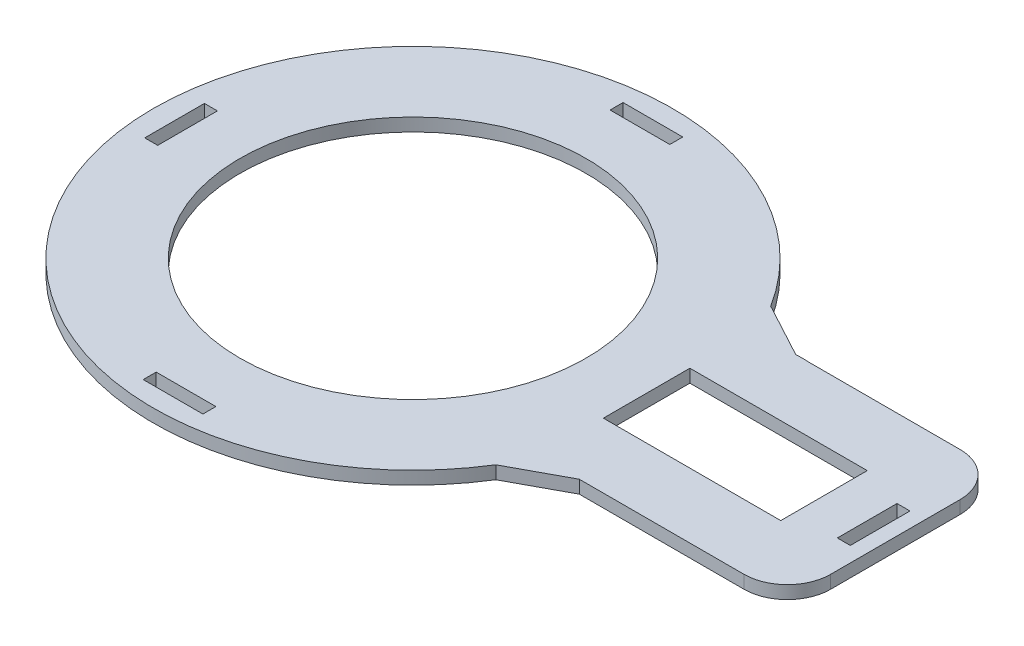
ISO-10303-21;
HEADER;
FILE_DESCRIPTION(('STEP AP214'),'2;1');
FILE_NAME('part.step','',(''),(''),'','','');
FILE_SCHEMA(('AUTOMOTIVE_DESIGN { 1 0 10303 214 1 1 1 1 }'));
ENDSEC;
DATA;
#1=APPLICATION_CONTEXT('core data for automotive mechanical design processes');
#2=APPLICATION_PROTOCOL_DEFINITION('international standard','automotive_design',2000,#1);
#3=PRODUCT_CONTEXT('',#1,'mechanical');
#4=PRODUCT('Part','Part','',(#3));
#5=PRODUCT_RELATED_PRODUCT_CATEGORY('part','',(#4));
#6=PRODUCT_DEFINITION_FORMATION('','',#4);
#7=PRODUCT_DEFINITION_CONTEXT('part definition',#1,'design');
#8=PRODUCT_DEFINITION('design','',#6,#7);
#9=PRODUCT_DEFINITION_SHAPE('','',#8);
#10=(LENGTH_UNIT() NAMED_UNIT(*) SI_UNIT(.MILLI.,.METRE.));
#11=(NAMED_UNIT(*) PLANE_ANGLE_UNIT() SI_UNIT($,.RADIAN.));
#12=(NAMED_UNIT(*) SI_UNIT($,.STERADIAN.) SOLID_ANGLE_UNIT());
#13=UNCERTAINTY_MEASURE_WITH_UNIT(LENGTH_MEASURE(1.E-05),#10,'distance_accuracy_value','');
#14=(GEOMETRIC_REPRESENTATION_CONTEXT(3) GLOBAL_UNCERTAINTY_ASSIGNED_CONTEXT((#13)) GLOBAL_UNIT_ASSIGNED_CONTEXT((#10,
#11,#12)) REPRESENTATION_CONTEXT('',''));
#15=CARTESIAN_POINT('',(0.,0.,0.));
#16=DIRECTION('',(0.,0.,1.));
#17=DIRECTION('',(1.,0.,0.));
#18=AXIS2_PLACEMENT_3D('',#15,#16,#17);
#19=CARTESIAN_POINT('',(65.,3.,0.));
#20=DIRECTION('',(0.,1.,0.));
#21=DIRECTION('',(0.,0.,1.));
#22=AXIS2_PLACEMENT_3D('',#19,#20,#21);
#23=PLANE('',#22);
#24=CARTESIAN_POINT('',(0.,3.,0.));
#25=DIRECTION('',(0.,1.,0.));
#26=DIRECTION('',(0.,0.,1.));
#27=AXIS2_PLACEMENT_3D('',#24,#25,#26);
#28=CIRCLE('',#27,40.);
#29=CARTESIAN_POINT('',(0.,3.,40.));
#30=VERTEX_POINT('',#29);
#31=EDGE_CURVE('E915',#30,#30,#28,.T.);
#32=ORIENTED_EDGE('',*,*,#31,.F.);
#33=EDGE_LOOP('',(#32));
#34=FACE_BOUND('',#33,.T.);
#35=DIRECTION('',(0.,0.,-1.));
#36=VECTOR('',#35,1.);
#37=CARTESIAN_POINT('',(95.0014401197598,3.,9.99999999999999));
#38=LINE('',#37,#36);
#39=CARTESIAN_POINT('',(95.0014401197598,3.,9.99999999999999));
#40=VERTEX_POINT('',#39);
#41=CARTESIAN_POINT('',(95.0014401197598,3.,-10.));
#42=VERTEX_POINT('',#41);
#43=EDGE_CURVE('E54',#40,#42,#38,.T.);
#44=ORIENTED_EDGE('',*,*,#43,.F.);
#45=DIRECTION('',(1.,0.,0.));
#46=VECTOR('',#45,1.);
#47=CARTESIAN_POINT('',(54.0014401197598,3.,9.99999999999999));
#48=LINE('',#47,#46);
#49=CARTESIAN_POINT('',(54.0014401197598,3.,9.99999999999999));
#50=VERTEX_POINT('',#49);
#51=EDGE_CURVE('E256',#50,#40,#48,.T.);
#52=ORIENTED_EDGE('',*,*,#51,.F.);
#53=DIRECTION('',(0.,0.,1.));
#54=VECTOR('',#53,1.);
#55=CARTESIAN_POINT('',(54.0014401197598,3.,9.99999999999999));
#56=LINE('',#55,#54);
#57=CARTESIAN_POINT('',(54.0014401197598,3.,-10.));
#58=VERTEX_POINT('',#57);
#59=EDGE_CURVE('E239',#58,#50,#56,.T.);
#60=ORIENTED_EDGE('',*,*,#59,.F.);
#61=DIRECTION('',(-1.,0.,0.));
#62=VECTOR('',#61,1.);
#63=CARTESIAN_POINT('',(54.0014401197598,3.,-10.));
#64=LINE('',#63,#62);
#65=EDGE_CURVE('E249',#42,#58,#64,.T.);
#66=ORIENTED_EDGE('',*,*,#65,.F.);
#67=EDGE_LOOP('',(#44,#52,#60,#66));
#68=FACE_BOUND('',#67,.T.);
#69=DIRECTION('',(0.880064172641751,0.,-0.474854769411017));
#70=VECTOR('',#69,1.);
#71=CARTESIAN_POINT('',(50.9013008311724,3.,31.7656665866543));
#72=LINE('',#71,#70);
#73=CARTESIAN_POINT('',(50.9013008311724,3.,31.7656665866543));
#74=VERTEX_POINT('',#73);
#75=CARTESIAN_POINT('',(63.5214401197598,3.,24.9562389129561));
#76=VERTEX_POINT('',#75);
#77=EDGE_CURVE('E459',#74,#76,#72,.T.);
#78=ORIENTED_EDGE('',*,*,#77,.T.);
#79=DIRECTION('',(0.,0.,1.));
#80=VECTOR('',#79,1.);
#81=CARTESIAN_POINT('',(63.5214401197598,3.,-24.9562389129561));
#82=LINE('',#81,#80);
#83=CARTESIAN_POINT('',(63.5214401197598,3.,25.));
#84=VERTEX_POINT('',#83);
#85=EDGE_CURVE('E299',#76,#84,#82,.T.);
#86=ORIENTED_EDGE('',*,*,#85,.T.);
#87=DIRECTION('',(1.,0.,0.));
#88=VECTOR('',#87,1.);
#89=CARTESIAN_POINT('',(63.5214401197598,3.,25.));
#90=LINE('',#89,#88);
#91=CARTESIAN_POINT('',(101.52144011976,3.,25.));
#92=VERTEX_POINT('',#91);
#93=EDGE_CURVE('E323',#84,#92,#90,.T.);
#94=ORIENTED_EDGE('',*,*,#93,.T.);
#95=CARTESIAN_POINT('',(101.52144011976,3.,15.));
#96=DIRECTION('',(0.,1.,0.));
#97=DIRECTION('',(0.,0.,1.));
#98=AXIS2_PLACEMENT_3D('',#95,#96,#97);
#99=CIRCLE('',#98,9.99999999999999);
#100=CARTESIAN_POINT('',(111.52144011976,3.,15.));
#101=VERTEX_POINT('',#100);
#102=EDGE_CURVE('E326',#92,#101,#99,.T.);
#103=ORIENTED_EDGE('',*,*,#102,.T.);
#104=DIRECTION('',(0.,0.,1.));
#105=VECTOR('',#104,1.);
#106=CARTESIAN_POINT('',(111.52144011976,3.,-14.9562389129561));
#107=LINE('',#106,#105);
#108=CARTESIAN_POINT('',(111.52144011976,3.,-14.9562389129561));
#109=VERTEX_POINT('',#108);
#110=EDGE_CURVE('E330',#109,#101,#107,.T.);
#111=ORIENTED_EDGE('',*,*,#110,.F.);
#112=CARTESIAN_POINT('',(101.52144011976,3.,-14.9562389129561));
#113=DIRECTION('',(0.,1.,0.));
#114=DIRECTION('',(0.,0.,1.));
#115=AXIS2_PLACEMENT_3D('',#112,#113,#114);
#116=CIRCLE('',#115,9.99999999999999);
#117=CARTESIAN_POINT('',(101.52144011976,3.,-24.9562389129561));
#118=VERTEX_POINT('',#117);
#119=EDGE_CURVE('E334',#109,#118,#116,.T.);
#120=ORIENTED_EDGE('',*,*,#119,.T.);
#121=DIRECTION('',(1.,0.,0.));
#122=VECTOR('',#121,1.);
#123=CARTESIAN_POINT('',(63.5214401197598,3.,-24.9562389129561));
#124=LINE('',#123,#122);
#125=CARTESIAN_POINT('',(66.4785598802402,3.,-24.9562389129561));
#126=VERTEX_POINT('',#125);
#127=EDGE_CURVE('E338',#126,#118,#124,.T.);
#128=ORIENTED_EDGE('',*,*,#127,.F.);
#129=CARTESIAN_POINT('',(65.,3.,0.));
#130=DIRECTION('',(0.,1.,0.));
#131=DIRECTION('',(0.,0.,1.));
#132=AXIS2_PLACEMENT_3D('',#129,#130,#131);
#133=CIRCLE('',#132,25.);
#134=CARTESIAN_POINT('',(63.5214401197598,3.,-24.9562389129561));
#135=VERTEX_POINT('',#134);
#136=EDGE_CURVE('E449',#126,#135,#133,.T.);
#137=ORIENTED_EDGE('',*,*,#136,.T.);
#138=DIRECTION('',(-0.880064172641751,0.,-0.474854769411017));
#139=VECTOR('',#138,1.);
#140=CARTESIAN_POINT('',(50.9013008311724,3.,-31.7656665866543));
#141=LINE('',#140,#139);
#142=CARTESIAN_POINT('',(50.9013008311724,3.,-31.7656665866543));
#143=VERTEX_POINT('',#142);
#144=EDGE_CURVE('E452',#135,#143,#141,.T.);
#145=ORIENTED_EDGE('',*,*,#144,.T.);
#146=CARTESIAN_POINT('',(0.,3.,0.));
#147=DIRECTION('',(0.,1.,0.));
#148=DIRECTION('',(0.,0.,1.));
#149=AXIS2_PLACEMENT_3D('',#146,#147,#148);
#150=CIRCLE('',#149,60.);
#151=EDGE_CURVE('E456',#143,#74,#150,.T.);
#152=ORIENTED_EDGE('',*,*,#151,.T.);
#153=EDGE_LOOP('',(#78,#86,#94,#103,#111,#120,#128,#137,#145,#152));
#154=FACE_BOUND('',#153,.T.);
#155=DIRECTION('',(0.,0.,-1.));
#156=VECTOR('',#155,1.);
#157=CARTESIAN_POINT('',(6.9,3.,55.4568517539151));
#158=LINE('',#157,#156);
#159=CARTESIAN_POINT('',(6.9,3.,55.4568517539151));
#160=VERTEX_POINT('',#159);
#161=CARTESIAN_POINT('',(6.9,3.,52.4568517539151));
#162=VERTEX_POINT('',#161);
#163=EDGE_CURVE('E365',#160,#162,#158,.T.);
#164=ORIENTED_EDGE('',*,*,#163,.F.);
#165=DIRECTION('',(1.,0.,0.));
#166=VECTOR('',#165,1.);
#167=CARTESIAN_POINT('',(-6.9,3.,55.4568517539151));
#168=LINE('',#167,#166);
#169=CARTESIAN_POINT('',(-6.9,3.,55.4568517539151));
#170=VERTEX_POINT('',#169);
#171=EDGE_CURVE('E377',#170,#160,#168,.T.);
#172=ORIENTED_EDGE('',*,*,#171,.F.);
#173=DIRECTION('',(0.,0.,1.));
#174=VECTOR('',#173,1.);
#175=CARTESIAN_POINT('',(-6.9,3.,55.4568517539151));
#176=LINE('',#175,#174);
#177=CARTESIAN_POINT('',(-6.9,3.,52.4568517539151));
#178=VERTEX_POINT('',#177);
#179=EDGE_CURVE('E373',#178,#170,#176,.T.);
#180=ORIENTED_EDGE('',*,*,#179,.F.);
#181=DIRECTION('',(-1.,0.,0.));
#182=VECTOR('',#181,1.);
#183=CARTESIAN_POINT('',(-6.9,3.,52.4568517539151));
#184=LINE('',#183,#182);
#185=EDGE_CURVE('E368',#162,#178,#184,.T.);
#186=ORIENTED_EDGE('',*,*,#185,.F.);
#187=EDGE_LOOP('',(#164,#172,#180,#186));
#188=FACE_BOUND('',#187,.T.);
#189=DIRECTION('',(0.,0.,-1.));
#190=VECTOR('',#189,1.);
#191=CARTESIAN_POINT('',(-52.1052277201253,3.,6.9));
#192=LINE('',#191,#190);
#193=CARTESIAN_POINT('',(-52.1052277201253,3.,6.9));
#194=VERTEX_POINT('',#193);
#195=CARTESIAN_POINT('',(-52.1052277201253,3.,-6.9));
#196=VERTEX_POINT('',#195);
#197=EDGE_CURVE('E395',#194,#196,#192,.T.);
#198=ORIENTED_EDGE('',*,*,#197,.F.);
#199=DIRECTION('',(1.,0.,0.));
#200=VECTOR('',#199,1.);
#201=CARTESIAN_POINT('',(-55.1052277201253,3.,6.9));
#202=LINE('',#201,#200);
#203=CARTESIAN_POINT('',(-55.1052277201253,3.,6.9));
#204=VERTEX_POINT('',#203);
#205=EDGE_CURVE('E407',#204,#194,#202,.T.);
#206=ORIENTED_EDGE('',*,*,#205,.F.);
#207=DIRECTION('',(0.,0.,1.));
#208=VECTOR('',#207,1.);
#209=CARTESIAN_POINT('',(-55.1052277201253,3.,6.9));
#210=LINE('',#209,#208);
#211=CARTESIAN_POINT('',(-55.1052277201253,3.,-6.9));
#212=VERTEX_POINT('',#211);
#213=EDGE_CURVE('E403',#212,#204,#210,.T.);
#214=ORIENTED_EDGE('',*,*,#213,.F.);
#215=DIRECTION('',(-1.,0.,0.));
#216=VECTOR('',#215,1.);
#217=CARTESIAN_POINT('',(-55.1052277201253,3.,-6.9));
#218=LINE('',#217,#216);
#219=EDGE_CURVE('E398',#196,#212,#218,.T.);
#220=ORIENTED_EDGE('',*,*,#219,.F.);
#221=EDGE_LOOP('',(#198,#206,#214,#220));
#222=FACE_BOUND('',#221,.T.);
#223=DIRECTION('',(0.,0.,1.));
#224=VECTOR('',#223,1.);
#225=CARTESIAN_POINT('',(-6.9,3.,-55.4568517539151));
#226=LINE('',#225,#224);
#227=CARTESIAN_POINT('',(-6.9,3.,-55.4568517539151));
#228=VERTEX_POINT('',#227);
#229=CARTESIAN_POINT('',(-6.9,3.,-52.4568517539151));
#230=VERTEX_POINT('',#229);
#231=EDGE_CURVE('E364',#228,#230,#226,.T.);
#232=ORIENTED_EDGE('',*,*,#231,.F.);
#233=DIRECTION('',(-1.,0.,0.));
#234=VECTOR('',#233,1.);
#235=CARTESIAN_POINT('',(-6.9,3.,-55.4568517539151));
#236=LINE('',#235,#234);
#237=CARTESIAN_POINT('',(6.9,3.,-55.4568517539151));
#238=VERTEX_POINT('',#237);
#239=EDGE_CURVE('E433',#238,#228,#236,.T.);
#240=ORIENTED_EDGE('',*,*,#239,.F.);
#241=DIRECTION('',(0.,0.,-1.));
#242=VECTOR('',#241,1.);
#243=CARTESIAN_POINT('',(6.9,3.,-55.4568517539151));
#244=LINE('',#243,#242);
#245=CARTESIAN_POINT('',(6.9,3.,-52.4568517539151));
#246=VERTEX_POINT('',#245);
#247=EDGE_CURVE('E429',#246,#238,#244,.T.);
#248=ORIENTED_EDGE('',*,*,#247,.F.);
#249=DIRECTION('',(1.,0.,0.));
#250=VECTOR('',#249,1.);
#251=CARTESIAN_POINT('',(-6.9,3.,-52.4568517539151));
#252=LINE('',#251,#250);
#253=EDGE_CURVE('E425',#230,#246,#252,.T.);
#254=ORIENTED_EDGE('',*,*,#253,.F.);
#255=EDGE_LOOP('',(#232,#240,#248,#254));
#256=FACE_BOUND('',#255,.T.);
#257=DIRECTION('',(0.,0.,-1.));
#258=VECTOR('',#257,1.);
#259=CARTESIAN_POINT('',(108.02144011976,3.,6.94376108704391));
#260=LINE('',#259,#258);
#261=CARTESIAN_POINT('',(108.02144011976,3.,6.94376108704391));
#262=VERTEX_POINT('',#261);
#263=CARTESIAN_POINT('',(108.02144011976,3.,-6.85623891295609));
#264=VERTEX_POINT('',#263);
#265=EDGE_CURVE('E282',#262,#264,#260,.T.);
#266=ORIENTED_EDGE('',*,*,#265,.F.);
#267=DIRECTION('',(-1.,0.,0.));
#268=VECTOR('',#267,1.);
#269=CARTESIAN_POINT('',(108.02144011976,3.,6.94376108704391));
#270=LINE('',#269,#268);
#271=CARTESIAN_POINT('',(105.02144011976,3.,6.94376108704391));
#272=VERTEX_POINT('',#271);
#273=EDGE_CURVE('E266',#262,#272,#270,.T.);
#274=ORIENTED_EDGE('',*,*,#273,.T.);
#275=DIRECTION('',(0.,0.,-1.));
#276=VECTOR('',#275,1.);
#277=CARTESIAN_POINT('',(105.02144011976,3.,6.94376108704391));
#278=LINE('',#277,#276);
#279=CARTESIAN_POINT('',(105.02144011976,3.,-6.85623891295609));
#280=VERTEX_POINT('',#279);
#281=EDGE_CURVE('E274',#272,#280,#278,.T.);
#282=ORIENTED_EDGE('',*,*,#281,.T.);
#283=DIRECTION('',(-1.,0.,0.));
#284=VECTOR('',#283,1.);
#285=CARTESIAN_POINT('',(108.02144011976,3.,-6.85623891295609));
#286=LINE('',#285,#284);
#287=EDGE_CURVE('E278',#264,#280,#286,.T.);
#288=ORIENTED_EDGE('',*,*,#287,.F.);
#289=EDGE_LOOP('',(#266,#274,#282,#288));
#290=FACE_BOUND('',#289,.T.);
#291=ADVANCED_FACE('F38',(#34,#68,#154,#188,#222,#256,#290),#23,.T.);
#292=CARTESIAN_POINT('',(65.,0.,0.));
#293=DIRECTION('',(0.,1.,0.));
#294=DIRECTION('',(0.,0.,1.));
#295=AXIS2_PLACEMENT_3D('',#292,#293,#294);
#296=PLANE('',#295);
#297=CARTESIAN_POINT('',(0.,0.,0.));
#298=DIRECTION('',(0.,1.,0.));
#299=DIRECTION('',(0.,0.,1.));
#300=AXIS2_PLACEMENT_3D('',#297,#298,#299);
#301=CIRCLE('',#300,40.);
#302=CARTESIAN_POINT('',(0.,0.,40.));
#303=VERTEX_POINT('',#302);
#304=EDGE_CURVE('E913',#303,#303,#301,.T.);
#305=ORIENTED_EDGE('',*,*,#304,.T.);
#306=EDGE_LOOP('',(#305));
#307=FACE_BOUND('',#306,.T.);
#308=DIRECTION('',(1.,0.,0.));
#309=VECTOR('',#308,1.);
#310=CARTESIAN_POINT('',(65.,0.,9.99999999999999));
#311=LINE('',#310,#309);
#312=CARTESIAN_POINT('',(54.0014401197598,0.,9.99999999999999));
#313=VERTEX_POINT('',#312);
#314=CARTESIAN_POINT('',(95.0014401197598,0.,9.99999999999999));
#315=VERTEX_POINT('',#314);
#316=EDGE_CURVE('E47',#313,#315,#311,.T.);
#317=ORIENTED_EDGE('',*,*,#316,.T.);
#318=DIRECTION('',(0.,0.,-1.));
#319=VECTOR('',#318,1.);
#320=CARTESIAN_POINT('',(95.0014401197598,0.,0.));
#321=LINE('',#320,#319);
#322=CARTESIAN_POINT('',(95.0014401197598,0.,-10.));
#323=VERTEX_POINT('',#322);
#324=EDGE_CURVE('E11',#315,#323,#321,.T.);
#325=ORIENTED_EDGE('',*,*,#324,.T.);
#326=DIRECTION('',(-1.,0.,0.));
#327=VECTOR('',#326,1.);
#328=CARTESIAN_POINT('',(65.,0.,-10.));
#329=LINE('',#328,#327);
#330=CARTESIAN_POINT('',(54.0014401197598,0.,-10.));
#331=VERTEX_POINT('',#330);
#332=EDGE_CURVE('E550',#323,#331,#329,.T.);
#333=ORIENTED_EDGE('',*,*,#332,.T.);
#334=DIRECTION('',(0.,0.,1.));
#335=VECTOR('',#334,1.);
#336=CARTESIAN_POINT('',(54.0014401197598,0.,0.));
#337=LINE('',#336,#335);
#338=EDGE_CURVE('E242',#331,#313,#337,.T.);
#339=ORIENTED_EDGE('',*,*,#338,.T.);
#340=EDGE_LOOP('',(#317,#325,#333,#339));
#341=FACE_BOUND('',#340,.T.);
#342=DIRECTION('',(-0.880064172641751,0.,-0.474854769411017));
#343=VECTOR('',#342,1.);
#344=CARTESIAN_POINT('',(50.9013008311724,0.,-31.7656665866543));
#345=LINE('',#344,#343);
#346=CARTESIAN_POINT('',(63.5214401197598,0.,-24.9562389129561));
#347=VERTEX_POINT('',#346);
#348=CARTESIAN_POINT('',(50.9013008311724,0.,-31.7656665866543));
#349=VERTEX_POINT('',#348);
#350=EDGE_CURVE('E465',#347,#349,#345,.T.);
#351=ORIENTED_EDGE('',*,*,#350,.F.);
#352=CARTESIAN_POINT('',(65.,0.,0.));
#353=DIRECTION('',(0.,1.,0.));
#354=DIRECTION('',(0.,0.,1.));
#355=AXIS2_PLACEMENT_3D('',#352,#353,#354);
#356=CIRCLE('',#355,25.);
#357=CARTESIAN_POINT('',(66.4785598802402,0.,-24.9562389129561));
#358=VERTEX_POINT('',#357);
#359=EDGE_CURVE('E385',#358,#347,#356,.T.);
#360=ORIENTED_EDGE('',*,*,#359,.F.);
#361=DIRECTION('',(-1.,0.,0.));
#362=VECTOR('',#361,1.);
#363=CARTESIAN_POINT('',(63.5214401197598,0.,-24.9562389129561));
#364=LINE('',#363,#362);
#365=CARTESIAN_POINT('',(101.52144011976,0.,-24.9562389129561));
#366=VERTEX_POINT('',#365);
#367=EDGE_CURVE('E311',#366,#358,#364,.T.);
#368=ORIENTED_EDGE('',*,*,#367,.F.);
#369=CARTESIAN_POINT('',(101.52144011976,0.,-14.9562389129561));
#370=DIRECTION('',(0.,1.,0.));
#371=DIRECTION('',(0.,0.,1.));
#372=AXIS2_PLACEMENT_3D('',#369,#370,#371);
#373=CIRCLE('',#372,9.99999999999999);
#374=CARTESIAN_POINT('',(111.52144011976,0.,-14.9562389129561));
#375=VERTEX_POINT('',#374);
#376=EDGE_CURVE('E308',#366,#375,#373,.F.);
#377=ORIENTED_EDGE('',*,*,#376,.T.);
#378=DIRECTION('',(0.,0.,-1.));
#379=VECTOR('',#378,1.);
#380=CARTESIAN_POINT('',(111.52144011976,0.,-14.9562389129561));
#381=LINE('',#380,#379);
#382=CARTESIAN_POINT('',(111.52144011976,0.,15.));
#383=VERTEX_POINT('',#382);
#384=EDGE_CURVE('E303',#383,#375,#381,.T.);
#385=ORIENTED_EDGE('',*,*,#384,.F.);
#386=CARTESIAN_POINT('',(101.52144011976,0.,15.));
#387=DIRECTION('',(0.,1.,0.));
#388=DIRECTION('',(0.,0.,1.));
#389=AXIS2_PLACEMENT_3D('',#386,#387,#388);
#390=CIRCLE('',#389,9.99999999999999);
#391=CARTESIAN_POINT('',(101.52144011976,0.,25.));
#392=VERTEX_POINT('',#391);
#393=EDGE_CURVE('E300',#383,#392,#390,.F.);
#394=ORIENTED_EDGE('',*,*,#393,.T.);
#395=DIRECTION('',(-1.,0.,0.));
#396=VECTOR('',#395,1.);
#397=CARTESIAN_POINT('',(63.5214401197598,0.,25.));
#398=LINE('',#397,#396);
#399=CARTESIAN_POINT('',(63.5214401197598,0.,25.));
#400=VERTEX_POINT('',#399);
#401=EDGE_CURVE('E319',#392,#400,#398,.T.);
#402=ORIENTED_EDGE('',*,*,#401,.T.);
#403=DIRECTION('',(0.,0.,-1.));
#404=VECTOR('',#403,1.);
#405=CARTESIAN_POINT('',(63.5214401197598,0.,-24.9562389129561));
#406=LINE('',#405,#404);
#407=CARTESIAN_POINT('',(63.5214401197598,0.,24.9562389129561));
#408=VERTEX_POINT('',#407);
#409=EDGE_CURVE('E315',#400,#408,#406,.T.);
#410=ORIENTED_EDGE('',*,*,#409,.T.);
#411=DIRECTION('',(0.880064172641751,0.,-0.474854769411017));
#412=VECTOR('',#411,1.);
#413=CARTESIAN_POINT('',(50.9013008311724,0.,31.7656665866543));
#414=LINE('',#413,#412);
#415=CARTESIAN_POINT('',(50.9013008311724,0.,31.7656665866543));
#416=VERTEX_POINT('',#415);
#417=EDGE_CURVE('E453',#416,#408,#414,.T.);
#418=ORIENTED_EDGE('',*,*,#417,.F.);
#419=CARTESIAN_POINT('',(0.,0.,0.));
#420=DIRECTION('',(0.,1.,0.));
#421=DIRECTION('',(0.,0.,1.));
#422=AXIS2_PLACEMENT_3D('',#419,#420,#421);
#423=CIRCLE('',#422,60.);
#424=EDGE_CURVE('E468',#349,#416,#423,.T.);
#425=ORIENTED_EDGE('',*,*,#424,.F.);
#426=EDGE_LOOP('',(#351,#360,#368,#377,#385,#394,#402,#410,#418,#425));
#427=FACE_BOUND('',#426,.T.);
#428=DIRECTION('',(-1.,0.,0.));
#429=VECTOR('',#428,1.);
#430=CARTESIAN_POINT('',(65.,0.,-55.4568517539151));
#431=LINE('',#430,#429);
#432=CARTESIAN_POINT('',(6.9,0.,-55.4568517539151));
#433=VERTEX_POINT('',#432);
#434=CARTESIAN_POINT('',(-6.9,0.,-55.4568517539151));
#435=VERTEX_POINT('',#434);
#436=EDGE_CURVE('E496',#433,#435,#431,.T.);
#437=ORIENTED_EDGE('',*,*,#436,.T.);
#438=DIRECTION('',(0.,0.,1.));
#439=VECTOR('',#438,1.);
#440=CARTESIAN_POINT('',(-6.90000000000003,0.,0.));
#441=LINE('',#440,#439);
#442=CARTESIAN_POINT('',(-6.9,0.,-52.4568517539151));
#443=VERTEX_POINT('',#442);
#444=EDGE_CURVE('E500',#435,#443,#441,.T.);
#445=ORIENTED_EDGE('',*,*,#444,.T.);
#446=DIRECTION('',(1.,0.,0.));
#447=VECTOR('',#446,1.);
#448=CARTESIAN_POINT('',(65.,0.,-52.4568517539151));
#449=LINE('',#448,#447);
#450=CARTESIAN_POINT('',(6.9,0.,-52.4568517539151));
#451=VERTEX_POINT('',#450);
#452=EDGE_CURVE('E488',#443,#451,#449,.T.);
#453=ORIENTED_EDGE('',*,*,#452,.T.);
#454=DIRECTION('',(0.,0.,-1.));
#455=VECTOR('',#454,1.);
#456=CARTESIAN_POINT('',(6.9,0.,0.));
#457=LINE('',#456,#455);
#458=EDGE_CURVE('E492',#451,#433,#457,.T.);
#459=ORIENTED_EDGE('',*,*,#458,.T.);
#460=EDGE_LOOP('',(#437,#445,#453,#459));
#461=FACE_BOUND('',#460,.T.);
#462=DIRECTION('',(1.,0.,0.));
#463=VECTOR('',#462,1.);
#464=CARTESIAN_POINT('',(65.,0.,6.9));
#465=LINE('',#464,#463);
#466=CARTESIAN_POINT('',(-55.1052277201253,0.,6.9));
#467=VERTEX_POINT('',#466);
#468=CARTESIAN_POINT('',(-52.1052277201253,0.,6.9));
#469=VERTEX_POINT('',#468);
#470=EDGE_CURVE('E512',#467,#469,#465,.T.);
#471=ORIENTED_EDGE('',*,*,#470,.T.);
#472=DIRECTION('',(0.,0.,-1.));
#473=VECTOR('',#472,1.);
#474=CARTESIAN_POINT('',(-52.1052277201253,0.,0.));
#475=LINE('',#474,#473);
#476=CARTESIAN_POINT('',(-52.1052277201253,0.,-6.9));
#477=VERTEX_POINT('',#476);
#478=EDGE_CURVE('E516',#469,#477,#475,.T.);
#479=ORIENTED_EDGE('',*,*,#478,.T.);
#480=DIRECTION('',(-1.,0.,0.));
#481=VECTOR('',#480,1.);
#482=CARTESIAN_POINT('',(65.,0.,-6.9));
#483=LINE('',#482,#481);
#484=CARTESIAN_POINT('',(-55.1052277201253,0.,-6.9));
#485=VERTEX_POINT('',#484);
#486=EDGE_CURVE('E504',#477,#485,#483,.T.);
#487=ORIENTED_EDGE('',*,*,#486,.T.);
#488=DIRECTION('',(0.,0.,1.));
#489=VECTOR('',#488,1.);
#490=CARTESIAN_POINT('',(-55.1052277201253,0.,0.));
#491=LINE('',#490,#489);
#492=EDGE_CURVE('E508',#485,#467,#491,.T.);
#493=ORIENTED_EDGE('',*,*,#492,.T.);
#494=EDGE_LOOP('',(#471,#479,#487,#493));
#495=FACE_BOUND('',#494,.T.);
#496=DIRECTION('',(1.,0.,0.));
#497=VECTOR('',#496,1.);
#498=CARTESIAN_POINT('',(65.,0.,55.4568517539151));
#499=LINE('',#498,#497);
#500=CARTESIAN_POINT('',(-6.9,0.,55.4568517539151));
#501=VERTEX_POINT('',#500);
#502=CARTESIAN_POINT('',(6.9,0.,55.4568517539151));
#503=VERTEX_POINT('',#502);
#504=EDGE_CURVE('E528',#501,#503,#499,.T.);
#505=ORIENTED_EDGE('',*,*,#504,.T.);
#506=DIRECTION('',(0.,0.,-1.));
#507=VECTOR('',#506,1.);
#508=CARTESIAN_POINT('',(6.9,0.,0.));
#509=LINE('',#508,#507);
#510=CARTESIAN_POINT('',(6.9,0.,52.4568517539151));
#511=VERTEX_POINT('',#510);
#512=EDGE_CURVE('E532',#503,#511,#509,.T.);
#513=ORIENTED_EDGE('',*,*,#512,.T.);
#514=DIRECTION('',(-1.,0.,0.));
#515=VECTOR('',#514,1.);
#516=CARTESIAN_POINT('',(65.,0.,52.4568517539151));
#517=LINE('',#516,#515);
#518=CARTESIAN_POINT('',(-6.9,0.,52.4568517539151));
#519=VERTEX_POINT('',#518);
#520=EDGE_CURVE('E520',#511,#519,#517,.T.);
#521=ORIENTED_EDGE('',*,*,#520,.T.);
#522=DIRECTION('',(0.,0.,1.));
#523=VECTOR('',#522,1.);
#524=CARTESIAN_POINT('',(-6.90000000000003,0.,0.));
#525=LINE('',#524,#523);
#526=EDGE_CURVE('E524',#519,#501,#525,.T.);
#527=ORIENTED_EDGE('',*,*,#526,.T.);
#528=EDGE_LOOP('',(#505,#513,#521,#527));
#529=FACE_BOUND('',#528,.T.);
#530=DIRECTION('',(-1.,0.,0.));
#531=VECTOR('',#530,1.);
#532=CARTESIAN_POINT('',(65.,0.,6.94376108704391));
#533=LINE('',#532,#531);
#534=CARTESIAN_POINT('',(108.02144011976,0.,6.94376108704391));
#535=VERTEX_POINT('',#534);
#536=CARTESIAN_POINT('',(105.02144011976,0.,6.94376108704391));
#537=VERTEX_POINT('',#536);
#538=EDGE_CURVE('E547',#535,#537,#533,.T.);
#539=ORIENTED_EDGE('',*,*,#538,.F.);
#540=DIRECTION('',(0.,0.,-1.));
#541=VECTOR('',#540,1.);
#542=CARTESIAN_POINT('',(108.02144011976,0.,0.));
#543=LINE('',#542,#541);
#544=CARTESIAN_POINT('',(108.02144011976,0.,-6.85623891295609));
#545=VERTEX_POINT('',#544);
#546=EDGE_CURVE('E536',#535,#545,#543,.T.);
#547=ORIENTED_EDGE('',*,*,#546,.T.);
#548=DIRECTION('',(-1.,0.,0.));
#549=VECTOR('',#548,1.);
#550=CARTESIAN_POINT('',(65.,0.,-6.85623891295609));
#551=LINE('',#550,#549);
#552=CARTESIAN_POINT('',(105.02144011976,0.,-6.85623891295609));
#553=VERTEX_POINT('',#552);
#554=EDGE_CURVE('E540',#545,#553,#551,.T.);
#555=ORIENTED_EDGE('',*,*,#554,.T.);
#556=DIRECTION('',(0.,0.,-1.));
#557=VECTOR('',#556,1.);
#558=CARTESIAN_POINT('',(105.02144011976,0.,0.));
#559=LINE('',#558,#557);
#560=EDGE_CURVE('E544',#537,#553,#559,.T.);
#561=ORIENTED_EDGE('',*,*,#560,.F.);
#562=EDGE_LOOP('',(#539,#547,#555,#561));
#563=FACE_BOUND('',#562,.T.);
#564=ADVANCED_FACE('F557',(#307,#341,#427,#461,#495,#529,#563),#296,.F.);
#565=CARTESIAN_POINT('',(65.,3.,0.));
#566=DIRECTION('',(0.,-1.,0.));
#567=DIRECTION('',(0.,0.,-1.));
#568=AXIS2_PLACEMENT_3D('',#565,#566,#567);
#569=CYLINDRICAL_SURFACE('',#568,25.);
#570=DIRECTION('',(0.,-1.,0.));
#571=VECTOR('',#570,1.);
#572=CARTESIAN_POINT('',(66.4785598802402,3.,-24.9562389129561));
#573=LINE('',#572,#571);
#574=EDGE_CURVE('E360',#358,#126,#573,.F.);
#575=ORIENTED_EDGE('',*,*,#574,.F.);
#576=ORIENTED_EDGE('',*,*,#359,.T.);
#577=DIRECTION('',(0.,-1.,0.));
#578=VECTOR('',#577,1.);
#579=CARTESIAN_POINT('',(63.5214401197598,3.,-24.9562389129561));
#580=LINE('',#579,#578);
#581=EDGE_CURVE('E484',#135,#347,#580,.T.);
#582=ORIENTED_EDGE('',*,*,#581,.F.);
#583=ORIENTED_EDGE('',*,*,#136,.F.);
#584=EDGE_LOOP('',(#575,#576,#582,#583));
#585=FACE_BOUND('',#584,.T.);
#586=ADVANCED_FACE('F40',(#585),#569,.T.);
#587=CARTESIAN_POINT('',(50.9013008311724,3.,-31.7656665866543));
#588=DIRECTION('',(-0.474854769411017,0.,0.880064172641751));
#589=DIRECTION('',(0.880064172641751,0.,0.474854769411017));
#590=AXIS2_PLACEMENT_3D('',#587,#588,#589);
#591=PLANE('',#590);
#592=ORIENTED_EDGE('',*,*,#350,.T.);
#593=DIRECTION('',(0.,-1.,0.));
#594=VECTOR('',#593,1.);
#595=CARTESIAN_POINT('',(50.9013008311724,3.,-31.7656665866543));
#596=LINE('',#595,#594);
#597=EDGE_CURVE('E480',#143,#349,#596,.T.);
#598=ORIENTED_EDGE('',*,*,#597,.F.);
#599=ORIENTED_EDGE('',*,*,#144,.F.);
#600=ORIENTED_EDGE('',*,*,#581,.T.);
#601=EDGE_LOOP('',(#592,#598,#599,#600));
#602=FACE_BOUND('',#601,.T.);
#603=ADVANCED_FACE('F595',(#602),#591,.F.);
#604=CARTESIAN_POINT('',(0.,3.,0.));
#605=DIRECTION('',(0.,-1.,0.));
#606=DIRECTION('',(0.,0.,-1.));
#607=AXIS2_PLACEMENT_3D('',#604,#605,#606);
#608=CYLINDRICAL_SURFACE('',#607,60.);
#609=ORIENTED_EDGE('',*,*,#424,.T.);
#610=DIRECTION('',(0.,-1.,0.));
#611=VECTOR('',#610,1.);
#612=CARTESIAN_POINT('',(50.9013008311724,3.,31.7656665866543));
#613=LINE('',#612,#611);
#614=EDGE_CURVE('E476',#74,#416,#613,.T.);
#615=ORIENTED_EDGE('',*,*,#614,.F.);
#616=ORIENTED_EDGE('',*,*,#151,.F.);
#617=ORIENTED_EDGE('',*,*,#597,.T.);
#618=EDGE_LOOP('',(#609,#615,#616,#617));
#619=FACE_BOUND('',#618,.T.);
#620=ADVANCED_FACE('F592',(#619),#608,.T.);
#621=CARTESIAN_POINT('',(50.9013008311724,3.,31.7656665866543));
#622=DIRECTION('',(-0.474854769411017,0.,-0.880064172641751));
#623=DIRECTION('',(-0.880064172641751,0.,0.474854769411017));
#624=AXIS2_PLACEMENT_3D('',#621,#622,#623);
#625=PLANE('',#624);
#626=ORIENTED_EDGE('',*,*,#417,.T.);
#627=DIRECTION('',(0.,-1.,0.));
#628=VECTOR('',#627,1.);
#629=CARTESIAN_POINT('',(63.5214401197598,3.,24.9562389129561));
#630=LINE('',#629,#628);
#631=EDGE_CURVE('E462',#76,#408,#630,.T.);
#632=ORIENTED_EDGE('',*,*,#631,.F.);
#633=ORIENTED_EDGE('',*,*,#77,.F.);
#634=ORIENTED_EDGE('',*,*,#614,.T.);
#635=EDGE_LOOP('',(#626,#632,#633,#634));
#636=FACE_BOUND('',#635,.T.);
#637=ADVANCED_FACE('F589',(#636),#625,.F.);
#638=CARTESIAN_POINT('',(-6.9,-7.,-55.4568517539151));
#639=DIRECTION('',(-1.,0.,0.));
#640=DIRECTION('',(0.,0.,1.));
#641=AXIS2_PLACEMENT_3D('',#638,#639,#640);
#642=PLANE('',#641);
#643=DIRECTION('',(0.,1.,0.));
#644=VECTOR('',#643,1.);
#645=CARTESIAN_POINT('',(-6.9,-7.,-55.4568517539151));
#646=LINE('',#645,#644);
#647=EDGE_CURVE('E399',#435,#228,#646,.T.);
#648=ORIENTED_EDGE('',*,*,#647,.T.);
#649=ORIENTED_EDGE('',*,*,#231,.T.);
#650=DIRECTION('',(0.,1.,0.));
#651=VECTOR('',#650,1.);
#652=CARTESIAN_POINT('',(-6.9,-7.,-52.4568517539151));
#653=LINE('',#652,#651);
#654=EDGE_CURVE('E437',#443,#230,#653,.T.);
#655=ORIENTED_EDGE('',*,*,#654,.F.);
#656=ORIENTED_EDGE('',*,*,#444,.F.);
#657=EDGE_LOOP('',(#648,#649,#655,#656));
#658=FACE_BOUND('',#657,.T.);
#659=ADVANCED_FACE('F586',(#658),#642,.F.);
#660=CARTESIAN_POINT('',(-6.9,-7.,-55.4568517539151));
#661=DIRECTION('',(0.,0.,-1.));
#662=DIRECTION('',(-1.,0.,0.));
#663=AXIS2_PLACEMENT_3D('',#660,#661,#662);
#664=PLANE('',#663);
#665=DIRECTION('',(0.,1.,0.));
#666=VECTOR('',#665,1.);
#667=CARTESIAN_POINT('',(6.9,-7.,-55.4568517539151));
#668=LINE('',#667,#666);
#669=EDGE_CURVE('E440',#433,#238,#668,.T.);
#670=ORIENTED_EDGE('',*,*,#669,.T.);
#671=ORIENTED_EDGE('',*,*,#239,.T.);
#672=ORIENTED_EDGE('',*,*,#647,.F.);
#673=ORIENTED_EDGE('',*,*,#436,.F.);
#674=EDGE_LOOP('',(#670,#671,#672,#673));
#675=FACE_BOUND('',#674,.T.);
#676=ADVANCED_FACE('F688',(#675),#664,.F.);
#677=CARTESIAN_POINT('',(6.9,-7.,-55.4568517539151));
#678=DIRECTION('',(1.,0.,0.));
#679=DIRECTION('',(0.,0.,-1.));
#680=AXIS2_PLACEMENT_3D('',#677,#678,#679);
#681=PLANE('',#680);
#682=DIRECTION('',(0.,1.,0.));
#683=VECTOR('',#682,1.);
#684=CARTESIAN_POINT('',(6.9,-7.,-52.4568517539151));
#685=LINE('',#684,#683);
#686=EDGE_CURVE('E443',#451,#246,#685,.T.);
#687=ORIENTED_EDGE('',*,*,#686,.T.);
#688=ORIENTED_EDGE('',*,*,#247,.T.);
#689=ORIENTED_EDGE('',*,*,#669,.F.);
#690=ORIENTED_EDGE('',*,*,#458,.F.);
#691=EDGE_LOOP('',(#687,#688,#689,#690));
#692=FACE_BOUND('',#691,.T.);
#693=ADVANCED_FACE('F691',(#692),#681,.F.);
#694=CARTESIAN_POINT('',(-6.9,-7.,-52.4568517539151));
#695=DIRECTION('',(0.,0.,1.));
#696=DIRECTION('',(1.,0.,0.));
#697=AXIS2_PLACEMENT_3D('',#694,#695,#696);
#698=PLANE('',#697);
#699=ORIENTED_EDGE('',*,*,#654,.T.);
#700=ORIENTED_EDGE('',*,*,#253,.T.);
#701=ORIENTED_EDGE('',*,*,#686,.F.);
#702=ORIENTED_EDGE('',*,*,#452,.F.);
#703=EDGE_LOOP('',(#699,#700,#701,#702));
#704=FACE_BOUND('',#703,.T.);
#705=ADVANCED_FACE('F686',(#704),#698,.F.);
#706=CARTESIAN_POINT('',(-52.1052277201253,-7.,6.9));
#707=DIRECTION('',(1.,0.,0.));
#708=DIRECTION('',(0.,0.,-1.));
#709=AXIS2_PLACEMENT_3D('',#706,#707,#708);
#710=PLANE('',#709);
#711=DIRECTION('',(0.,1.,0.));
#712=VECTOR('',#711,1.);
#713=CARTESIAN_POINT('',(-52.1052277201253,-7.,6.9));
#714=LINE('',#713,#712);
#715=EDGE_CURVE('E369',#469,#194,#714,.T.);
#716=ORIENTED_EDGE('',*,*,#715,.T.);
#717=ORIENTED_EDGE('',*,*,#197,.T.);
#718=DIRECTION('',(0.,1.,0.));
#719=VECTOR('',#718,1.);
#720=CARTESIAN_POINT('',(-52.1052277201253,-7.,-6.9));
#721=LINE('',#720,#719);
#722=EDGE_CURVE('E411',#477,#196,#721,.T.);
#723=ORIENTED_EDGE('',*,*,#722,.F.);
#724=ORIENTED_EDGE('',*,*,#478,.F.);
#725=EDGE_LOOP('',(#716,#717,#723,#724));
#726=FACE_BOUND('',#725,.T.);
#727=ADVANCED_FACE('F676',(#726),#710,.F.);
#728=CARTESIAN_POINT('',(-55.1052277201253,-7.,6.9));
#729=DIRECTION('',(0.,0.,1.));
#730=DIRECTION('',(1.,0.,0.));
#731=AXIS2_PLACEMENT_3D('',#728,#729,#730);
#732=PLANE('',#731);
#733=DIRECTION('',(0.,1.,0.));
#734=VECTOR('',#733,1.);
#735=CARTESIAN_POINT('',(-55.1052277201253,-7.,6.9));
#736=LINE('',#735,#734);
#737=EDGE_CURVE('E414',#467,#204,#736,.T.);
#738=ORIENTED_EDGE('',*,*,#737,.T.);
#739=ORIENTED_EDGE('',*,*,#205,.T.);
#740=ORIENTED_EDGE('',*,*,#715,.F.);
#741=ORIENTED_EDGE('',*,*,#470,.F.);
#742=EDGE_LOOP('',(#738,#739,#740,#741));
#743=FACE_BOUND('',#742,.T.);
#744=ADVANCED_FACE('F672',(#743),#732,.F.);
#745=CARTESIAN_POINT('',(-55.1052277201253,-7.,6.9));
#746=DIRECTION('',(-1.,0.,0.));
#747=DIRECTION('',(0.,0.,1.));
#748=AXIS2_PLACEMENT_3D('',#745,#746,#747);
#749=PLANE('',#748);
#750=DIRECTION('',(0.,1.,0.));
#751=VECTOR('',#750,1.);
#752=CARTESIAN_POINT('',(-55.1052277201253,-7.,-6.9));
#753=LINE('',#752,#751);
#754=EDGE_CURVE('E417',#485,#212,#753,.T.);
#755=ORIENTED_EDGE('',*,*,#754,.T.);
#756=ORIENTED_EDGE('',*,*,#213,.T.);
#757=ORIENTED_EDGE('',*,*,#737,.F.);
#758=ORIENTED_EDGE('',*,*,#492,.F.);
#759=EDGE_LOOP('',(#755,#756,#757,#758));
#760=FACE_BOUND('',#759,.T.);
#761=ADVANCED_FACE('F675',(#760),#749,.F.);
#762=CARTESIAN_POINT('',(-55.1052277201253,-7.,-6.9));
#763=DIRECTION('',(0.,0.,-1.));
#764=DIRECTION('',(-1.,0.,0.));
#765=AXIS2_PLACEMENT_3D('',#762,#763,#764);
#766=PLANE('',#765);
#767=ORIENTED_EDGE('',*,*,#722,.T.);
#768=ORIENTED_EDGE('',*,*,#219,.T.);
#769=ORIENTED_EDGE('',*,*,#754,.F.);
#770=ORIENTED_EDGE('',*,*,#486,.F.);
#771=EDGE_LOOP('',(#767,#768,#769,#770));
#772=FACE_BOUND('',#771,.T.);
#773=ADVANCED_FACE('F670',(#772),#766,.F.);
#774=CARTESIAN_POINT('',(6.9,-7.,55.4568517539151));
#775=DIRECTION('',(1.,0.,0.));
#776=DIRECTION('',(0.,0.,-1.));
#777=AXIS2_PLACEMENT_3D('',#774,#775,#776);
#778=PLANE('',#777);
#779=DIRECTION('',(0.,1.,0.));
#780=VECTOR('',#779,1.);
#781=CARTESIAN_POINT('',(6.9,-7.,55.4568517539151));
#782=LINE('',#781,#780);
#783=EDGE_CURVE('E382',#503,#160,#782,.T.);
#784=ORIENTED_EDGE('',*,*,#783,.T.);
#785=ORIENTED_EDGE('',*,*,#163,.T.);
#786=DIRECTION('',(0.,1.,0.));
#787=VECTOR('',#786,1.);
#788=CARTESIAN_POINT('',(6.9,-7.,52.4568517539151));
#789=LINE('',#788,#787);
#790=EDGE_CURVE('E381',#511,#162,#789,.T.);
#791=ORIENTED_EDGE('',*,*,#790,.F.);
#792=ORIENTED_EDGE('',*,*,#512,.F.);
#793=EDGE_LOOP('',(#784,#785,#791,#792));
#794=FACE_BOUND('',#793,.T.);
#795=ADVANCED_FACE('F660',(#794),#778,.F.);
#796=CARTESIAN_POINT('',(-6.9,-7.,55.4568517539151));
#797=DIRECTION('',(0.,0.,1.));
#798=DIRECTION('',(1.,0.,0.));
#799=AXIS2_PLACEMENT_3D('',#796,#797,#798);
#800=PLANE('',#799);
#801=DIRECTION('',(0.,1.,0.));
#802=VECTOR('',#801,1.);
#803=CARTESIAN_POINT('',(-6.9,-7.,55.4568517539151));
#804=LINE('',#803,#802);
#805=EDGE_CURVE('E386',#501,#170,#804,.T.);
#806=ORIENTED_EDGE('',*,*,#805,.T.);
#807=ORIENTED_EDGE('',*,*,#171,.T.);
#808=ORIENTED_EDGE('',*,*,#783,.F.);
#809=ORIENTED_EDGE('',*,*,#504,.F.);
#810=EDGE_LOOP('',(#806,#807,#808,#809));
#811=FACE_BOUND('',#810,.T.);
#812=ADVANCED_FACE('F656',(#811),#800,.F.);
#813=CARTESIAN_POINT('',(-6.9,-7.,55.4568517539151));
#814=DIRECTION('',(-1.,0.,0.));
#815=DIRECTION('',(0.,0.,1.));
#816=AXIS2_PLACEMENT_3D('',#813,#814,#815);
#817=PLANE('',#816);
#818=DIRECTION('',(0.,1.,0.));
#819=VECTOR('',#818,1.);
#820=CARTESIAN_POINT('',(-6.9,-7.,52.4568517539151));
#821=LINE('',#820,#819);
#822=EDGE_CURVE('E389',#519,#178,#821,.T.);
#823=ORIENTED_EDGE('',*,*,#822,.T.);
#824=ORIENTED_EDGE('',*,*,#179,.T.);
#825=ORIENTED_EDGE('',*,*,#805,.F.);
#826=ORIENTED_EDGE('',*,*,#526,.F.);
#827=EDGE_LOOP('',(#823,#824,#825,#826));
#828=FACE_BOUND('',#827,.T.);
#829=ADVANCED_FACE('F659',(#828),#817,.F.);
#830=CARTESIAN_POINT('',(-6.9,-7.,52.4568517539151));
#831=DIRECTION('',(0.,0.,-1.));
#832=DIRECTION('',(-1.,0.,0.));
#833=AXIS2_PLACEMENT_3D('',#830,#831,#832);
#834=PLANE('',#833);
#835=ORIENTED_EDGE('',*,*,#790,.T.);
#836=ORIENTED_EDGE('',*,*,#185,.T.);
#837=ORIENTED_EDGE('',*,*,#822,.F.);
#838=ORIENTED_EDGE('',*,*,#520,.F.);
#839=EDGE_LOOP('',(#835,#836,#837,#838));
#840=FACE_BOUND('',#839,.T.);
#841=ADVANCED_FACE('F655',(#840),#834,.F.);
#842=CARTESIAN_POINT('',(63.5214401197598,-69.2793317399089,-24.9562389129561));
#843=DIRECTION('',(-1.,0.,0.));
#844=DIRECTION('',(0.,0.,1.));
#845=AXIS2_PLACEMENT_3D('',#842,#843,#844);
#846=PLANE('',#845);
#847=ORIENTED_EDGE('',*,*,#631,.T.);
#848=ORIENTED_EDGE('',*,*,#409,.F.);
#849=DIRECTION('',(0.,1.,0.));
#850=VECTOR('',#849,1.);
#851=CARTESIAN_POINT('',(63.5214401197598,-69.2793317399089,25.));
#852=LINE('',#851,#850);
#853=EDGE_CURVE('E341',#400,#84,#852,.T.);
#854=ORIENTED_EDGE('',*,*,#853,.T.);
#855=ORIENTED_EDGE('',*,*,#85,.F.);
#856=EDGE_LOOP('',(#847,#848,#854,#855));
#857=FACE_BOUND('',#856,.T.);
#858=ADVANCED_FACE('F618',(#857),#846,.T.);
#859=CARTESIAN_POINT('',(63.5214401197598,-69.2793317399089,-24.9562389129561));
#860=DIRECTION('',(0.,0.,1.));
#861=DIRECTION('',(1.,0.,0.));
#862=AXIS2_PLACEMENT_3D('',#859,#860,#861);
#863=PLANE('',#862);
#864=ORIENTED_EDGE('',*,*,#367,.T.);
#865=ORIENTED_EDGE('',*,*,#574,.T.);
#866=ORIENTED_EDGE('',*,*,#127,.T.);
#867=DIRECTION('',(0.,1.,0.));
#868=VECTOR('',#867,1.);
#869=CARTESIAN_POINT('',(101.52144011976,-69.2793317399089,-24.9562389129561));
#870=LINE('',#869,#868);
#871=EDGE_CURVE('E304',#366,#118,#870,.T.);
#872=ORIENTED_EDGE('',*,*,#871,.F.);
#873=EDGE_LOOP('',(#864,#865,#866,#872));
#874=FACE_BOUND('',#873,.T.);
#875=ADVANCED_FACE('F625',(#874),#863,.F.);
#876=CARTESIAN_POINT('',(63.5214401197598,-69.2793317399089,25.));
#877=DIRECTION('',(0.,0.,1.));
#878=DIRECTION('',(1.,0.,0.));
#879=AXIS2_PLACEMENT_3D('',#876,#877,#878);
#880=PLANE('',#879);
#881=ORIENTED_EDGE('',*,*,#853,.F.);
#882=ORIENTED_EDGE('',*,*,#401,.F.);
#883=DIRECTION('',(0.,1.,0.));
#884=VECTOR('',#883,1.);
#885=CARTESIAN_POINT('',(101.52144011976,-69.2793317399089,25.));
#886=LINE('',#885,#884);
#887=EDGE_CURVE('E351',#392,#92,#886,.T.);
#888=ORIENTED_EDGE('',*,*,#887,.T.);
#889=ORIENTED_EDGE('',*,*,#93,.F.);
#890=EDGE_LOOP('',(#881,#882,#888,#889));
#891=FACE_BOUND('',#890,.T.);
#892=ADVANCED_FACE('F641',(#891),#880,.T.);
#893=CARTESIAN_POINT('',(101.52144011976,-69.2793317399089,-14.9562389129561));
#894=DIRECTION('',(0.,1.,0.));
#895=DIRECTION('',(0.,0.,1.));
#896=AXIS2_PLACEMENT_3D('',#893,#894,#895);
#897=CYLINDRICAL_SURFACE('',#896,9.99999999999999);
#898=ORIENTED_EDGE('',*,*,#376,.F.);
#899=ORIENTED_EDGE('',*,*,#871,.T.);
#900=ORIENTED_EDGE('',*,*,#119,.F.);
#901=DIRECTION('',(0.,1.,0.));
#902=VECTOR('',#901,1.);
#903=CARTESIAN_POINT('',(111.52144011976,-69.2793317399089,-14.9562389129561));
#904=LINE('',#903,#902);
#905=EDGE_CURVE('E345',#375,#109,#904,.T.);
#906=ORIENTED_EDGE('',*,*,#905,.F.);
#907=EDGE_LOOP('',(#898,#899,#900,#906));
#908=FACE_BOUND('',#907,.T.);
#909=ADVANCED_FACE('F628',(#908),#897,.T.);
#910=CARTESIAN_POINT('',(111.52144011976,-69.2793317399089,-14.9562389129561));
#911=DIRECTION('',(-1.,0.,0.));
#912=DIRECTION('',(0.,0.,1.));
#913=AXIS2_PLACEMENT_3D('',#910,#911,#912);
#914=PLANE('',#913);
#915=DIRECTION('',(0.,1.,0.));
#916=VECTOR('',#915,1.);
#917=CARTESIAN_POINT('',(111.52144011976,-69.2793317399089,15.));
#918=LINE('',#917,#916);
#919=EDGE_CURVE('E348',#383,#101,#918,.T.);
#920=ORIENTED_EDGE('',*,*,#919,.F.);
#921=ORIENTED_EDGE('',*,*,#384,.T.);
#922=ORIENTED_EDGE('',*,*,#905,.T.);
#923=ORIENTED_EDGE('',*,*,#110,.T.);
#924=EDGE_LOOP('',(#920,#921,#922,#923));
#925=FACE_BOUND('',#924,.T.);
#926=ADVANCED_FACE('F634',(#925),#914,.F.);
#927=CARTESIAN_POINT('',(101.52144011976,-69.2793317399089,15.));
#928=DIRECTION('',(0.,1.,0.));
#929=DIRECTION('',(0.,0.,1.));
#930=AXIS2_PLACEMENT_3D('',#927,#928,#929);
#931=CYLINDRICAL_SURFACE('',#930,9.99999999999999);
#932=ORIENTED_EDGE('',*,*,#393,.F.);
#933=ORIENTED_EDGE('',*,*,#919,.T.);
#934=ORIENTED_EDGE('',*,*,#102,.F.);
#935=ORIENTED_EDGE('',*,*,#887,.F.);
#936=EDGE_LOOP('',(#932,#933,#934,#935));
#937=FACE_BOUND('',#936,.T.);
#938=ADVANCED_FACE('F638',(#937),#931,.T.);
#939=CARTESIAN_POINT('',(108.02144011976,-17.,6.94376108704391));
#940=DIRECTION('',(0.,0.,-1.));
#941=DIRECTION('',(-1.,0.,0.));
#942=AXIS2_PLACEMENT_3D('',#939,#940,#941);
#943=PLANE('',#942);
#944=ORIENTED_EDGE('',*,*,#538,.T.);
#945=DIRECTION('',(0.,1.,0.));
#946=VECTOR('',#945,1.);
#947=CARTESIAN_POINT('',(105.02144011976,-17.,6.94376108704391));
#948=LINE('',#947,#946);
#949=EDGE_CURVE('E296',#537,#272,#948,.T.);
#950=ORIENTED_EDGE('',*,*,#949,.T.);
#951=ORIENTED_EDGE('',*,*,#273,.F.);
#952=DIRECTION('',(0.,1.,0.));
#953=VECTOR('',#952,1.);
#954=CARTESIAN_POINT('',(108.02144011976,-17.,6.94376108704391));
#955=LINE('',#954,#953);
#956=EDGE_CURVE('E286',#535,#262,#955,.T.);
#957=ORIENTED_EDGE('',*,*,#956,.F.);
#958=EDGE_LOOP('',(#944,#950,#951,#957));
#959=FACE_BOUND('',#958,.T.);
#960=ADVANCED_FACE('F823',(#959),#943,.T.);
#961=CARTESIAN_POINT('',(105.02144011976,-17.,6.94376108704391));
#962=DIRECTION('',(1.,0.,0.));
#963=DIRECTION('',(0.,0.,-1.));
#964=AXIS2_PLACEMENT_3D('',#961,#962,#963);
#965=PLANE('',#964);
#966=ORIENTED_EDGE('',*,*,#560,.T.);
#967=DIRECTION('',(0.,1.,0.));
#968=VECTOR('',#967,1.);
#969=CARTESIAN_POINT('',(105.02144011976,-17.,-6.85623891295609));
#970=LINE('',#969,#968);
#971=EDGE_CURVE('E293',#553,#280,#970,.T.);
#972=ORIENTED_EDGE('',*,*,#971,.T.);
#973=ORIENTED_EDGE('',*,*,#281,.F.);
#974=ORIENTED_EDGE('',*,*,#949,.F.);
#975=EDGE_LOOP('',(#966,#972,#973,#974));
#976=FACE_BOUND('',#975,.T.);
#977=ADVANCED_FACE('F832',(#976),#965,.T.);
#978=CARTESIAN_POINT('',(108.02144011976,-17.,-6.85623891295609));
#979=DIRECTION('',(0.,0.,-1.));
#980=DIRECTION('',(-1.,0.,0.));
#981=AXIS2_PLACEMENT_3D('',#978,#979,#980);
#982=PLANE('',#981);
#983=DIRECTION('',(0.,1.,0.));
#984=VECTOR('',#983,1.);
#985=CARTESIAN_POINT('',(108.02144011976,-17.,-6.85623891295609));
#986=LINE('',#985,#984);
#987=EDGE_CURVE('E290',#545,#264,#986,.T.);
#988=ORIENTED_EDGE('',*,*,#987,.T.);
#989=ORIENTED_EDGE('',*,*,#287,.T.);
#990=ORIENTED_EDGE('',*,*,#971,.F.);
#991=ORIENTED_EDGE('',*,*,#554,.F.);
#992=EDGE_LOOP('',(#988,#989,#990,#991));
#993=FACE_BOUND('',#992,.T.);
#994=ADVANCED_FACE('F571',(#993),#982,.F.);
#995=CARTESIAN_POINT('',(108.02144011976,-17.,6.94376108704391));
#996=DIRECTION('',(1.,0.,0.));
#997=DIRECTION('',(0.,0.,-1.));
#998=AXIS2_PLACEMENT_3D('',#995,#996,#997);
#999=PLANE('',#998);
#1000=ORIENTED_EDGE('',*,*,#956,.T.);
#1001=ORIENTED_EDGE('',*,*,#265,.T.);
#1002=ORIENTED_EDGE('',*,*,#987,.F.);
#1003=ORIENTED_EDGE('',*,*,#546,.F.);
#1004=EDGE_LOOP('',(#1000,#1001,#1002,#1003));
#1005=FACE_BOUND('',#1004,.T.);
#1006=ADVANCED_FACE('F564',(#1005),#999,.F.);
#1007=CARTESIAN_POINT('',(95.0014401197598,-7.,9.99999999999999));
#1008=DIRECTION('',(1.,0.,0.));
#1009=DIRECTION('',(0.,0.,-1.));
#1010=AXIS2_PLACEMENT_3D('',#1007,#1008,#1009);
#1011=PLANE('',#1010);
#1012=DIRECTION('',(0.,1.,0.));
#1013=VECTOR('',#1012,1.);
#1014=CARTESIAN_POINT('',(95.0014401197598,-7.,9.99999999999999));
#1015=LINE('',#1014,#1013);
#1016=EDGE_CURVE('E263',#315,#40,#1015,.T.);
#1017=ORIENTED_EDGE('',*,*,#1016,.T.);
#1018=ORIENTED_EDGE('',*,*,#43,.T.);
#1019=DIRECTION('',(0.,1.,0.));
#1020=VECTOR('',#1019,1.);
#1021=CARTESIAN_POINT('',(95.0014401197598,-7.,-10.));
#1022=LINE('',#1021,#1020);
#1023=EDGE_CURVE('E246',#323,#42,#1022,.T.);
#1024=ORIENTED_EDGE('',*,*,#1023,.F.);
#1025=ORIENTED_EDGE('',*,*,#324,.F.);
#1026=EDGE_LOOP('',(#1017,#1018,#1024,#1025));
#1027=FACE_BOUND('',#1026,.T.);
#1028=ADVANCED_FACE('F562',(#1027),#1011,.F.);
#1029=CARTESIAN_POINT('',(54.0014401197598,-7.,9.99999999999999));
#1030=DIRECTION('',(0.,0.,1.));
#1031=DIRECTION('',(1.,0.,0.));
#1032=AXIS2_PLACEMENT_3D('',#1029,#1030,#1031);
#1033=PLANE('',#1032);
#1034=DIRECTION('',(0.,1.,0.));
#1035=VECTOR('',#1034,1.);
#1036=CARTESIAN_POINT('',(54.0014401197598,-7.,9.99999999999999));
#1037=LINE('',#1036,#1035);
#1038=EDGE_CURVE('E245',#313,#50,#1037,.T.);
#1039=ORIENTED_EDGE('',*,*,#1038,.T.);
#1040=ORIENTED_EDGE('',*,*,#51,.T.);
#1041=ORIENTED_EDGE('',*,*,#1016,.F.);
#1042=ORIENTED_EDGE('',*,*,#316,.F.);
#1043=EDGE_LOOP('',(#1039,#1040,#1041,#1042));
#1044=FACE_BOUND('',#1043,.T.);
#1045=ADVANCED_FACE('F561',(#1044),#1033,.F.);
#1046=CARTESIAN_POINT('',(54.0014401197598,-7.,9.99999999999999));
#1047=DIRECTION('',(-1.,0.,0.));
#1048=DIRECTION('',(0.,0.,1.));
#1049=AXIS2_PLACEMENT_3D('',#1046,#1047,#1048);
#1050=PLANE('',#1049);
#1051=DIRECTION('',(0.,1.,0.));
#1052=VECTOR('',#1051,1.);
#1053=CARTESIAN_POINT('',(54.0014401197598,-7.,-10.));
#1054=LINE('',#1053,#1052);
#1055=EDGE_CURVE('E62',#331,#58,#1054,.T.);
#1056=ORIENTED_EDGE('',*,*,#1055,.T.);
#1057=ORIENTED_EDGE('',*,*,#59,.T.);
#1058=ORIENTED_EDGE('',*,*,#1038,.F.);
#1059=ORIENTED_EDGE('',*,*,#338,.F.);
#1060=EDGE_LOOP('',(#1056,#1057,#1058,#1059));
#1061=FACE_BOUND('',#1060,.T.);
#1062=ADVANCED_FACE('F236',(#1061),#1050,.F.);
#1063=CARTESIAN_POINT('',(54.0014401197598,-7.,-10.));
#1064=DIRECTION('',(0.,0.,-1.));
#1065=DIRECTION('',(-1.,0.,0.));
#1066=AXIS2_PLACEMENT_3D('',#1063,#1064,#1065);
#1067=PLANE('',#1066);
#1068=ORIENTED_EDGE('',*,*,#1023,.T.);
#1069=ORIENTED_EDGE('',*,*,#65,.T.);
#1070=ORIENTED_EDGE('',*,*,#1055,.F.);
#1071=ORIENTED_EDGE('',*,*,#332,.F.);
#1072=EDGE_LOOP('',(#1068,#1069,#1070,#1071));
#1073=FACE_BOUND('',#1072,.T.);
#1074=ADVANCED_FACE('F250',(#1073),#1067,.F.);
#1075=CARTESIAN_POINT('',(0.,0.,0.));
#1076=DIRECTION('',(0.,1.,0.));
#1077=DIRECTION('',(0.,0.,1.));
#1078=AXIS2_PLACEMENT_3D('',#1075,#1076,#1077);
#1079=CYLINDRICAL_SURFACE('',#1078,40.);
#1080=ORIENTED_EDGE('',*,*,#304,.F.);
#1081=EDGE_LOOP('',(#1080));
#1082=FACE_BOUND('',#1081,.T.);
#1083=ORIENTED_EDGE('',*,*,#31,.T.);
#1084=EDGE_LOOP('',(#1083));
#1085=FACE_BOUND('',#1084,.T.);
#1086=ADVANCED_FACE('F883',(#1082,#1085),#1079,.F.);
#1087=CLOSED_SHELL('',(#291,#564,#586,#603,#620,#637,#659,#676,#693,#705,#727,#744,#761,#773,
#795,#812,#829,#841,#858,#875,#892,#909,#926,#938,#960,#977,#994,#1006,#1028,#1045,#1062,#1074,#1086));
#1088=MANIFOLD_SOLID_BREP('B2',#1087);
#1089=ADVANCED_BREP_SHAPE_REPRESENTATION('',(#18,#1088),#14);
#1090=SHAPE_DEFINITION_REPRESENTATION(#9,#1089);
ENDSEC;
END-ISO-10303-21;
